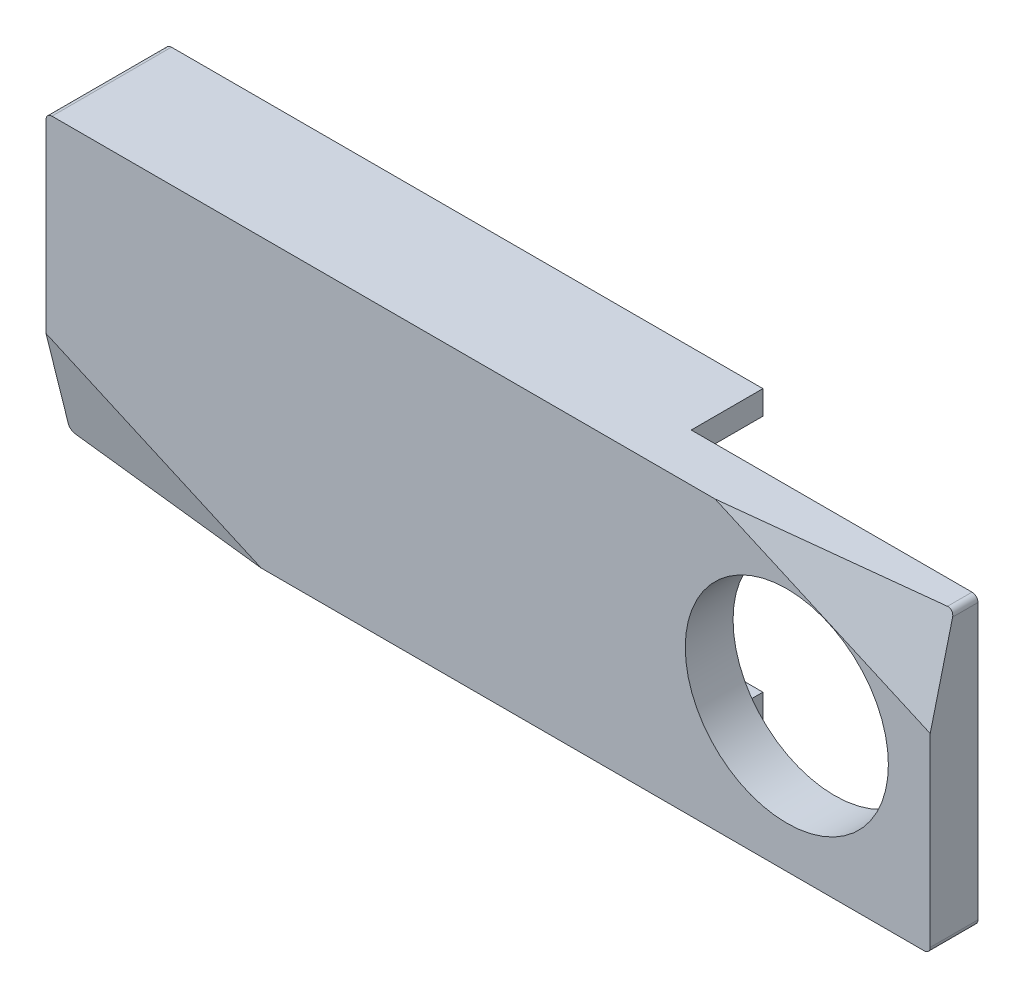
ISO-10303-21;
HEADER;
FILE_DESCRIPTION(('STEP AP214'),'2;1');
FILE_NAME('part.step','',(''),(''),'','','');
FILE_SCHEMA(('AUTOMOTIVE_DESIGN { 1 0 10303 214 1 1 1 1 }'));
ENDSEC;
DATA;
#1=APPLICATION_CONTEXT('core data for automotive mechanical design processes');
#2=APPLICATION_PROTOCOL_DEFINITION('international standard','automotive_design',2000,#1);
#3=PRODUCT_CONTEXT('',#1,'mechanical');
#4=PRODUCT('Part','Part','',(#3));
#5=PRODUCT_RELATED_PRODUCT_CATEGORY('part','',(#4));
#6=PRODUCT_DEFINITION_FORMATION('','',#4);
#7=PRODUCT_DEFINITION_CONTEXT('part definition',#1,'design');
#8=PRODUCT_DEFINITION('design','',#6,#7);
#9=PRODUCT_DEFINITION_SHAPE('','',#8);
#10=(LENGTH_UNIT() NAMED_UNIT(*) SI_UNIT(.MILLI.,.METRE.));
#11=(NAMED_UNIT(*) PLANE_ANGLE_UNIT() SI_UNIT($,.RADIAN.));
#12=(NAMED_UNIT(*) SI_UNIT($,.STERADIAN.) SOLID_ANGLE_UNIT());
#13=UNCERTAINTY_MEASURE_WITH_UNIT(LENGTH_MEASURE(1.E-05),#10,'distance_accuracy_value','');
#14=(GEOMETRIC_REPRESENTATION_CONTEXT(3) GLOBAL_UNCERTAINTY_ASSIGNED_CONTEXT((#13)) GLOBAL_UNIT_ASSIGNED_CONTEXT((#10,
#11,#12)) REPRESENTATION_CONTEXT('',''));
#15=CARTESIAN_POINT('',(0.,0.,0.));
#16=DIRECTION('',(0.,0.,1.));
#17=DIRECTION('',(1.,0.,0.));
#18=AXIS2_PLACEMENT_3D('',#15,#16,#17);
#19=CARTESIAN_POINT('',(-24.,-24.,6.));
#20=DIRECTION('',(-1.,0.,0.));
#21=DIRECTION('',(0.,0.,1.));
#22=AXIS2_PLACEMENT_3D('',#19,#20,#21);
#23=PLANE('',#22);
#24=DIRECTION('',(0.,0.,1.));
#25=VECTOR('',#24,1.);
#26=CARTESIAN_POINT('',(-24.,-22.,0.));
#27=LINE('',#26,#25);
#28=CARTESIAN_POINT('',(-24.,-22.,0.));
#29=VERTEX_POINT('',#28);
#30=CARTESIAN_POINT('',(-24.,-22.,6.));
#31=VERTEX_POINT('',#30);
#32=EDGE_CURVE('E204',#29,#31,#27,.T.);
#33=ORIENTED_EDGE('',*,*,#32,.T.);
#34=DIRECTION('',(0.,1.,0.));
#35=VECTOR('',#34,1.);
#36=CARTESIAN_POINT('',(-24.,-24.,6.));
#37=LINE('',#36,#35);
#38=CARTESIAN_POINT('',(-24.,-24.,6.));
#39=VERTEX_POINT('',#38);
#40=EDGE_CURVE('E223',#39,#31,#37,.T.);
#41=ORIENTED_EDGE('',*,*,#40,.F.);
#42=DIRECTION('',(0.,0.,-1.));
#43=VECTOR('',#42,1.);
#44=CARTESIAN_POINT('',(-24.,-24.,6.));
#45=LINE('',#44,#43);
#46=CARTESIAN_POINT('',(-24.,-24.,0.));
#47=VERTEX_POINT('',#46);
#48=EDGE_CURVE('E229',#39,#47,#45,.T.);
#49=ORIENTED_EDGE('',*,*,#48,.T.);
#50=DIRECTION('',(0.,1.,0.));
#51=VECTOR('',#50,1.);
#52=CARTESIAN_POINT('',(-24.,-24.,0.));
#53=LINE('',#52,#51);
#54=EDGE_CURVE('E220',#47,#29,#53,.T.);
#55=ORIENTED_EDGE('',*,*,#54,.T.);
#56=EDGE_LOOP('',(#33,#41,#49,#55));
#57=FACE_BOUND('',#56,.T.);
#58=ADVANCED_FACE('F35',(#57),#23,.F.);
#59=CARTESIAN_POINT('',(0.,0.,10.));
#60=DIRECTION('',(0.,0.,-1.));
#61=DIRECTION('',(-1.,0.,0.));
#62=AXIS2_PLACEMENT_3D('',#59,#60,#61);
#63=PLANE('',#62);
#64=DIRECTION('',(1.,0.,0.));
#65=VECTOR('',#64,1.);
#66=CARTESIAN_POINT('',(0.,-24.,10.));
#67=LINE('',#66,#65);
#68=CARTESIAN_POINT('',(-56.,-24.,10.));
#69=VERTEX_POINT('',#68);
#70=CARTESIAN_POINT('',(-0.499999999999997,-24.,10.));
#71=VERTEX_POINT('',#70);
#72=EDGE_CURVE('E250',#69,#71,#67,.T.);
#73=ORIENTED_EDGE('',*,*,#72,.T.);
#74=CARTESIAN_POINT('',(-0.499999999999997,-23.5,10.));
#75=DIRECTION('',(0.,0.,-1.));
#76=DIRECTION('',(-1.,0.,0.));
#77=AXIS2_PLACEMENT_3D('',#74,#75,#76);
#78=CIRCLE('',#77,0.5);
#79=CARTESIAN_POINT('',(0.,-23.5,10.));
#80=VERTEX_POINT('',#79);
#81=EDGE_CURVE('E300',#71,#80,#78,.F.);
#82=ORIENTED_EDGE('',*,*,#81,.T.);
#83=DIRECTION('',(0.,1.,0.));
#84=VECTOR('',#83,1.);
#85=CARTESIAN_POINT('',(0.,0.,10.));
#86=LINE('',#85,#84);
#87=CARTESIAN_POINT('',(0.,-7.99999999999999,10.));
#88=VERTEX_POINT('',#87);
#89=EDGE_CURVE('E242',#80,#88,#86,.T.);
#90=ORIENTED_EDGE('',*,*,#89,.T.);
#91=DIRECTION('',(-0.913811548620257,0.406138466053448,0.));
#92=VECTOR('',#91,1.);
#93=CARTESIAN_POINT('',(-2.96907216494845,-6.68041237113401,10.));
#94=LINE('',#93,#92);
#95=CARTESIAN_POINT('',(-18.,0.,10.));
#96=VERTEX_POINT('',#95);
#97=EDGE_CURVE('E264',#88,#96,#94,.T.);
#98=ORIENTED_EDGE('',*,*,#97,.T.);
#99=DIRECTION('',(-1.,0.,0.));
#100=VECTOR('',#99,1.);
#101=CARTESIAN_POINT('',(0.,0.,10.));
#102=LINE('',#101,#100);
#103=CARTESIAN_POINT('',(-73.5,0.,10.));
#104=VERTEX_POINT('',#103);
#105=EDGE_CURVE('E244',#96,#104,#102,.T.);
#106=ORIENTED_EDGE('',*,*,#105,.T.);
#107=CARTESIAN_POINT('',(-73.5,-0.500000000000009,10.));
#108=DIRECTION('',(0.,0.,-1.));
#109=DIRECTION('',(-1.,0.,0.));
#110=AXIS2_PLACEMENT_3D('',#107,#108,#109);
#111=CIRCLE('',#110,0.5);
#112=CARTESIAN_POINT('',(-74.,-0.500000000000009,10.));
#113=VERTEX_POINT('',#112);
#114=EDGE_CURVE('E298',#104,#113,#111,.F.);
#115=ORIENTED_EDGE('',*,*,#114,.T.);
#116=DIRECTION('',(0.,-1.,0.));
#117=VECTOR('',#116,1.);
#118=CARTESIAN_POINT('',(-74.,0.,10.));
#119=LINE('',#118,#117);
#120=CARTESIAN_POINT('',(-74.,-16.,10.));
#121=VERTEX_POINT('',#120);
#122=EDGE_CURVE('E248',#113,#121,#119,.T.);
#123=ORIENTED_EDGE('',*,*,#122,.T.);
#124=DIRECTION('',(-0.913811548620257,0.406138466053447,0.));
#125=VECTOR('',#124,1.);
#126=CARTESIAN_POINT('',(-18.1443298969072,-40.8247422680412,10.));
#127=LINE('',#126,#125);
#128=EDGE_CURVE('E267',#69,#121,#127,.T.);
#129=ORIENTED_EDGE('',*,*,#128,.F.);
#130=EDGE_LOOP('',(#73,#82,#90,#98,#106,#115,#123,#129));
#131=FACE_BOUND('',#130,.T.);
#132=CARTESIAN_POINT('',(-12.,-12.,10.));
#133=DIRECTION('',(0.,0.,-1.));
#134=DIRECTION('',(-1.,0.,0.));
#135=AXIS2_PLACEMENT_3D('',#132,#133,#134);
#136=CIRCLE('',#135,8.5);
#137=CARTESIAN_POINT('',(-20.5,-12.,10.));
#138=VERTEX_POINT('',#137);
#139=EDGE_CURVE('E238',#138,#138,#136,.T.);
#140=ORIENTED_EDGE('',*,*,#139,.T.);
#141=EDGE_LOOP('',(#140));
#142=FACE_BOUND('',#141,.T.);
#143=ADVANCED_FACE('F325',(#131,#142),#63,.F.);
#144=CARTESIAN_POINT('',(0.,0.,10.));
#145=DIRECTION('',(0.,-1.,0.));
#146=DIRECTION('',(1.,0.,0.));
#147=AXIS2_PLACEMENT_3D('',#144,#145,#146);
#148=PLANE('',#147);
#149=DIRECTION('',(0.993883734673619,0.,-0.110431526074847));
#150=VECTOR('',#149,1.);
#151=CARTESIAN_POINT('',(-0.219512195121951,0.,8.02439024390244));
#152=LINE('',#151,#150);
#153=CARTESIAN_POINT('',(-0.5,0.,8.05555555555556));
#154=VERTEX_POINT('',#153);
#155=EDGE_CURVE('E261',#96,#154,#152,.T.);
#156=ORIENTED_EDGE('',*,*,#155,.T.);
#157=DIRECTION('',(0.,0.,-1.));
#158=VECTOR('',#157,1.);
#159=CARTESIAN_POINT('',(-0.5,0.,10.));
#160=LINE('',#159,#158);
#161=CARTESIAN_POINT('',(-0.5,0.,6.));
#162=VERTEX_POINT('',#161);
#163=EDGE_CURVE('E279',#154,#162,#160,.T.);
#164=ORIENTED_EDGE('',*,*,#163,.T.);
#165=DIRECTION('',(1.,0.,0.));
#166=VECTOR('',#165,1.);
#167=CARTESIAN_POINT('',(0.,0.,6.));
#168=LINE('',#167,#166);
#169=CARTESIAN_POINT('',(-24.,0.,6.));
#170=VERTEX_POINT('',#169);
#171=EDGE_CURVE('E226',#170,#162,#168,.T.);
#172=ORIENTED_EDGE('',*,*,#171,.F.);
#173=DIRECTION('',(0.,0.,-1.));
#174=VECTOR('',#173,1.);
#175=CARTESIAN_POINT('',(-24.,0.,6.));
#176=LINE('',#175,#174);
#177=CARTESIAN_POINT('',(-24.,0.,0.));
#178=VERTEX_POINT('',#177);
#179=EDGE_CURVE('E232',#170,#178,#176,.T.);
#180=ORIENTED_EDGE('',*,*,#179,.T.);
#181=DIRECTION('',(-1.,0.,0.));
#182=VECTOR('',#181,1.);
#183=CARTESIAN_POINT('',(0.,0.,0.));
#184=LINE('',#183,#182);
#185=CARTESIAN_POINT('',(-73.5,0.,0.));
#186=VERTEX_POINT('',#185);
#187=EDGE_CURVE('E241',#178,#186,#184,.T.);
#188=ORIENTED_EDGE('',*,*,#187,.T.);
#189=DIRECTION('',(0.,0.,-1.));
#190=VECTOR('',#189,1.);
#191=CARTESIAN_POINT('',(-73.5,0.,10.));
#192=LINE('',#191,#190);
#193=EDGE_CURVE('E277',#186,#104,#192,.F.);
#194=ORIENTED_EDGE('',*,*,#193,.T.);
#195=ORIENTED_EDGE('',*,*,#105,.F.);
#196=EDGE_LOOP('',(#156,#164,#172,#180,#188,#194,#195));
#197=FACE_BOUND('',#196,.T.);
#198=ADVANCED_FACE('F317',(#197),#148,.F.);
#199=CARTESIAN_POINT('',(0.,0.,10.));
#200=DIRECTION('',(-1.,0.,0.));
#201=DIRECTION('',(0.,-1.,0.));
#202=AXIS2_PLACEMENT_3D('',#199,#200,#201);
#203=PLANE('',#202);
#204=DIRECTION('',(0.,-1.,0.));
#205=VECTOR('',#204,1.);
#206=CARTESIAN_POINT('',(0.,-24.,6.));
#207=LINE('',#206,#205);
#208=CARTESIAN_POINT('',(0.,-0.5,6.));
#209=VERTEX_POINT('',#208);
#210=CARTESIAN_POINT('',(0.,-23.5,6.));
#211=VERTEX_POINT('',#210);
#212=EDGE_CURVE('E216',#209,#211,#207,.T.);
#213=ORIENTED_EDGE('',*,*,#212,.F.);
#214=DIRECTION('',(0.,0.,-1.));
#215=VECTOR('',#214,1.);
#216=CARTESIAN_POINT('',(0.,-0.5,10.));
#217=LINE('',#216,#215);
#218=CARTESIAN_POINT('',(0.,-0.5,8.125));
#219=VERTEX_POINT('',#218);
#220=EDGE_CURVE('E289',#209,#219,#217,.F.);
#221=ORIENTED_EDGE('',*,*,#220,.T.);
#222=DIRECTION('',(0.,-0.970142500145332,0.242535625036333));
#223=VECTOR('',#222,1.);
#224=CARTESIAN_POINT('',(0.,-0.470588235294118,8.11764705882353));
#225=LINE('',#224,#223);
#226=EDGE_CURVE('E253',#219,#88,#225,.T.);
#227=ORIENTED_EDGE('',*,*,#226,.T.);
#228=ORIENTED_EDGE('',*,*,#89,.F.);
#229=DIRECTION('',(0.,0.,-1.));
#230=VECTOR('',#229,1.);
#231=CARTESIAN_POINT('',(0.,-23.5,10.));
#232=LINE('',#231,#230);
#233=EDGE_CURVE('E286',#80,#211,#232,.T.);
#234=ORIENTED_EDGE('',*,*,#233,.T.);
#235=EDGE_LOOP('',(#213,#221,#227,#228,#234));
#236=FACE_BOUND('',#235,.T.);
#237=ADVANCED_FACE('F344',(#236),#203,.F.);
#238=CARTESIAN_POINT('',(-74.,0.,10.));
#239=DIRECTION('',(1.,0.,0.));
#240=DIRECTION('',(0.,0.,-1.));
#241=AXIS2_PLACEMENT_3D('',#238,#239,#240);
#242=PLANE('',#241);
#243=DIRECTION('',(0.,1.,0.));
#244=VECTOR('',#243,1.);
#245=CARTESIAN_POINT('',(-74.,-20.,7.));
#246=LINE('',#245,#244);
#247=CARTESIAN_POINT('',(-74.,-20.,7.));
#248=VERTEX_POINT('',#247);
#249=CARTESIAN_POINT('',(-74.,-4.,7.));
#250=VERTEX_POINT('',#249);
#251=EDGE_CURVE('E172',#248,#250,#246,.T.);
#252=ORIENTED_EDGE('',*,*,#251,.F.);
#253=DIRECTION('',(0.,0.,-1.));
#254=VECTOR('',#253,1.);
#255=CARTESIAN_POINT('',(-74.,-20.,7.));
#256=LINE('',#255,#254);
#257=CARTESIAN_POINT('',(-74.,-20.,0.));
#258=VERTEX_POINT('',#257);
#259=EDGE_CURVE('E207',#248,#258,#256,.T.);
#260=ORIENTED_EDGE('',*,*,#259,.T.);
#261=DIRECTION('',(0.,-1.,0.));
#262=VECTOR('',#261,1.);
#263=CARTESIAN_POINT('',(-74.,0.,0.));
#264=LINE('',#263,#262);
#265=CARTESIAN_POINT('',(-74.,-23.5,0.));
#266=VERTEX_POINT('',#265);
#267=EDGE_CURVE('E256',#258,#266,#264,.T.);
#268=ORIENTED_EDGE('',*,*,#267,.T.);
#269=DIRECTION('',(0.,0.,-1.));
#270=VECTOR('',#269,1.);
#271=CARTESIAN_POINT('',(-74.,-23.5,10.));
#272=LINE('',#271,#270);
#273=CARTESIAN_POINT('',(-74.,-23.5,8.12500000000001));
#274=VERTEX_POINT('',#273);
#275=EDGE_CURVE('E302',#266,#274,#272,.F.);
#276=ORIENTED_EDGE('',*,*,#275,.T.);
#277=DIRECTION('',(0.,-0.970142500145332,-0.242535625036333));
#278=VECTOR('',#277,1.);
#279=CARTESIAN_POINT('',(-74.,-0.941176470588247,13.7647058823529));
#280=LINE('',#279,#278);
#281=EDGE_CURVE('E272',#121,#274,#280,.T.);
#282=ORIENTED_EDGE('',*,*,#281,.F.);
#283=ORIENTED_EDGE('',*,*,#122,.F.);
#284=DIRECTION('',(0.,0.,-1.));
#285=VECTOR('',#284,1.);
#286=CARTESIAN_POINT('',(-74.,-0.500000000000009,10.));
#287=LINE('',#286,#285);
#288=CARTESIAN_POINT('',(-74.,-0.500000000000009,0.));
#289=VERTEX_POINT('',#288);
#290=EDGE_CURVE('E304',#113,#289,#287,.T.);
#291=ORIENTED_EDGE('',*,*,#290,.T.);
#292=CARTESIAN_POINT('',(-74.,-4.,0.));
#293=VERTEX_POINT('',#292);
#294=EDGE_CURVE('E187',#289,#293,#264,.T.);
#295=ORIENTED_EDGE('',*,*,#294,.T.);
#296=DIRECTION('',(0.,0.,-1.));
#297=VECTOR('',#296,1.);
#298=CARTESIAN_POINT('',(-74.,-4.,7.));
#299=LINE('',#298,#297);
#300=EDGE_CURVE('E50',#250,#293,#299,.T.);
#301=ORIENTED_EDGE('',*,*,#300,.F.);
#302=EDGE_LOOP('',(#252,#260,#268,#276,#282,#283,#291,#295,#301));
#303=FACE_BOUND('',#302,.T.);
#304=ADVANCED_FACE('F184',(#303),#242,.F.);
#305=CARTESIAN_POINT('',(0.,-24.,10.));
#306=DIRECTION('',(0.,1.,0.));
#307=DIRECTION('',(-1.,0.,0.));
#308=AXIS2_PLACEMENT_3D('',#305,#306,#307);
#309=PLANE('',#308);
#310=DIRECTION('',(-1.,0.,0.));
#311=VECTOR('',#310,1.);
#312=CARTESIAN_POINT('',(0.,-24.,6.));
#313=LINE('',#312,#311);
#314=CARTESIAN_POINT('',(-0.499999999999997,-24.,6.));
#315=VERTEX_POINT('',#314);
#316=EDGE_CURVE('E219',#315,#39,#313,.T.);
#317=ORIENTED_EDGE('',*,*,#316,.F.);
#318=DIRECTION('',(0.,0.,-1.));
#319=VECTOR('',#318,1.);
#320=CARTESIAN_POINT('',(-0.499999999999997,-24.,10.));
#321=LINE('',#320,#319);
#322=EDGE_CURVE('E296',#315,#71,#321,.F.);
#323=ORIENTED_EDGE('',*,*,#322,.T.);
#324=ORIENTED_EDGE('',*,*,#72,.F.);
#325=DIRECTION('',(0.993883734673619,0.,0.110431526074847));
#326=VECTOR('',#325,1.);
#327=CARTESIAN_POINT('',(-0.68292682926829,-24.,16.1463414634146));
#328=LINE('',#327,#326);
#329=CARTESIAN_POINT('',(-73.5,-24.,8.05555555555556));
#330=VERTEX_POINT('',#329);
#331=EDGE_CURVE('E275',#330,#69,#328,.T.);
#332=ORIENTED_EDGE('',*,*,#331,.F.);
#333=DIRECTION('',(0.,0.,-1.));
#334=VECTOR('',#333,1.);
#335=CARTESIAN_POINT('',(-73.5,-24.,10.));
#336=LINE('',#335,#334);
#337=CARTESIAN_POINT('',(-73.5,-24.,0.));
#338=VERTEX_POINT('',#337);
#339=EDGE_CURVE('E293',#330,#338,#336,.T.);
#340=ORIENTED_EDGE('',*,*,#339,.T.);
#341=DIRECTION('',(1.,0.,0.));
#342=VECTOR('',#341,1.);
#343=CARTESIAN_POINT('',(0.,-24.,0.));
#344=LINE('',#343,#342);
#345=EDGE_CURVE('E245',#338,#47,#344,.T.);
#346=ORIENTED_EDGE('',*,*,#345,.T.);
#347=ORIENTED_EDGE('',*,*,#48,.F.);
#348=EDGE_LOOP('',(#317,#323,#324,#332,#340,#346,#347));
#349=FACE_BOUND('',#348,.T.);
#350=ADVANCED_FACE('F367',(#349),#309,.F.);
#351=CARTESIAN_POINT('',(0.,0.,0.));
#352=DIRECTION('',(0.,0.,-1.));
#353=DIRECTION('',(-1.,0.,0.));
#354=AXIS2_PLACEMENT_3D('',#351,#352,#353);
#355=PLANE('',#354);
#356=DIRECTION('',(-1.,0.,0.));
#357=VECTOR('',#356,1.);
#358=CARTESIAN_POINT('',(-74.,-20.,0.));
#359=LINE('',#358,#357);
#360=CARTESIAN_POINT('',(-41.,-20.,0.));
#361=VERTEX_POINT('',#360);
#362=EDGE_CURVE('E181',#361,#258,#359,.T.);
#363=ORIENTED_EDGE('',*,*,#362,.F.);
#364=DIRECTION('',(0.,-1.,0.));
#365=VECTOR('',#364,1.);
#366=CARTESIAN_POINT('',(-41.,-20.,0.));
#367=LINE('',#366,#365);
#368=CARTESIAN_POINT('',(-41.,-4.,0.));
#369=VERTEX_POINT('',#368);
#370=EDGE_CURVE('E563',#369,#361,#367,.T.);
#371=ORIENTED_EDGE('',*,*,#370,.F.);
#372=DIRECTION('',(1.,0.,0.));
#373=VECTOR('',#372,1.);
#374=CARTESIAN_POINT('',(-74.,-4.,0.));
#375=LINE('',#374,#373);
#376=EDGE_CURVE('E566',#293,#369,#375,.T.);
#377=ORIENTED_EDGE('',*,*,#376,.F.);
#378=ORIENTED_EDGE('',*,*,#294,.F.);
#379=CARTESIAN_POINT('',(-73.5,-0.500000000000009,0.));
#380=DIRECTION('',(0.,0.,-1.));
#381=DIRECTION('',(-1.,0.,0.));
#382=AXIS2_PLACEMENT_3D('',#379,#380,#381);
#383=CIRCLE('',#382,0.5);
#384=EDGE_CURVE('E43',#289,#186,#383,.T.);
#385=ORIENTED_EDGE('',*,*,#384,.T.);
#386=ORIENTED_EDGE('',*,*,#187,.F.);
#387=CARTESIAN_POINT('',(-24.,-2.00000000000001,0.));
#388=VERTEX_POINT('',#387);
#389=EDGE_CURVE('E214',#388,#178,#53,.T.);
#390=ORIENTED_EDGE('',*,*,#389,.F.);
#391=DIRECTION('',(1.,0.,0.));
#392=VECTOR('',#391,1.);
#393=CARTESIAN_POINT('',(-39.,-2.00000000000001,0.));
#394=LINE('',#393,#392);
#395=CARTESIAN_POINT('',(-39.,-2.00000000000001,0.));
#396=VERTEX_POINT('',#395);
#397=EDGE_CURVE('E201',#396,#388,#394,.T.);
#398=ORIENTED_EDGE('',*,*,#397,.F.);
#399=DIRECTION('',(0.,-1.,0.));
#400=VECTOR('',#399,1.);
#401=CARTESIAN_POINT('',(-39.,-2.00000000000001,0.));
#402=LINE('',#401,#400);
#403=CARTESIAN_POINT('',(-39.,-22.,0.));
#404=VERTEX_POINT('',#403);
#405=EDGE_CURVE('E211',#396,#404,#402,.T.);
#406=ORIENTED_EDGE('',*,*,#405,.T.);
#407=DIRECTION('',(1.,0.,0.));
#408=VECTOR('',#407,1.);
#409=CARTESIAN_POINT('',(-39.,-22.,0.));
#410=LINE('',#409,#408);
#411=EDGE_CURVE('E198',#404,#29,#410,.T.);
#412=ORIENTED_EDGE('',*,*,#411,.T.);
#413=ORIENTED_EDGE('',*,*,#54,.F.);
#414=ORIENTED_EDGE('',*,*,#345,.F.);
#415=CARTESIAN_POINT('',(-73.5,-23.5,0.));
#416=DIRECTION('',(0.,0.,-1.));
#417=DIRECTION('',(-1.,0.,0.));
#418=AXIS2_PLACEMENT_3D('',#415,#416,#417);
#419=CIRCLE('',#418,0.5);
#420=EDGE_CURVE('E306',#338,#266,#419,.T.);
#421=ORIENTED_EDGE('',*,*,#420,.T.);
#422=ORIENTED_EDGE('',*,*,#267,.F.);
#423=EDGE_LOOP('',(#363,#371,#377,#378,#385,#386,#390,#398,#406,#412,#413,#414,#421,#422));
#424=FACE_BOUND('',#423,.T.);
#425=ADVANCED_FACE('F311',(#424),#355,.T.);
#426=CARTESIAN_POINT('',(0.826992103374013,1.86073223259153,7.44292893036612));
#427=DIRECTION('',(-0.107172764430849,-0.24113871996941,-0.964554879877638));
#428=DIRECTION('',(0.,0.970142500145332,-0.242535625036333));
#429=AXIS2_PLACEMENT_3D('',#426,#427,#428);
#430=PLANE('',#429);
#431=ORIENTED_EDGE('',*,*,#226,.F.);
#432=CARTESIAN_POINT('',(-0.5,-0.5,8.18055555555556));
#433=DIRECTION('',(-0.107172764430849,-0.24113871996941,-0.964554879877638));
#434=DIRECTION('',(0.391742839337871,0.88142138851021,-0.263882329276205));
#435=AXIS2_PLACEMENT_3D('',#432,#433,#434);
#436=ELLIPSE('',#435,0.518373822403376,0.5);
#437=EDGE_CURVE('E291',#219,#154,#436,.F.);
#438=ORIENTED_EDGE('',*,*,#437,.T.);
#439=ORIENTED_EDGE('',*,*,#155,.F.);
#440=ORIENTED_EDGE('',*,*,#97,.F.);
#441=EDGE_LOOP('',(#431,#438,#439,#440));
#442=FACE_BOUND('',#441,.T.);
#443=ADVANCED_FACE('F357',(#442),#430,.F.);
#444=CARTESIAN_POINT('',(-12.,-12.,10.));
#445=DIRECTION('',(0.,0.,-1.));
#446=DIRECTION('',(-1.,0.,0.));
#447=AXIS2_PLACEMENT_3D('',#444,#445,#446);
#448=CYLINDRICAL_SURFACE('',#447,8.5);
#449=CARTESIAN_POINT('',(-12.,-12.,6.));
#450=DIRECTION('',(0.,0.,1.));
#451=DIRECTION('',(1.,0.,0.));
#452=AXIS2_PLACEMENT_3D('',#449,#450,#451);
#453=CIRCLE('',#452,8.5);
#454=CARTESIAN_POINT('',(-3.5,-12.,6.));
#455=VERTEX_POINT('',#454);
#456=EDGE_CURVE('E235',#455,#455,#453,.F.);
#457=ORIENTED_EDGE('',*,*,#456,.T.);
#458=EDGE_LOOP('',(#457));
#459=FACE_BOUND('',#458,.T.);
#460=ORIENTED_EDGE('',*,*,#139,.F.);
#461=EDGE_LOOP('',(#460));
#462=FACE_BOUND('',#461,.T.);
#463=ADVANCED_FACE('F359',(#459,#462),#448,.F.);
#464=CARTESIAN_POINT('',(0.,0.,6.));
#465=DIRECTION('',(0.,0.,1.));
#466=DIRECTION('',(1.,0.,0.));
#467=AXIS2_PLACEMENT_3D('',#464,#465,#466);
#468=PLANE('',#467);
#469=ORIENTED_EDGE('',*,*,#171,.T.);
#470=CARTESIAN_POINT('',(-0.5,-0.5,6.));
#471=DIRECTION('',(0.,0.,1.));
#472=DIRECTION('',(1.,0.,0.));
#473=AXIS2_PLACEMENT_3D('',#470,#471,#472);
#474=CIRCLE('',#473,0.5);
#475=EDGE_CURVE('E284',#162,#209,#474,.F.);
#476=ORIENTED_EDGE('',*,*,#475,.T.);
#477=ORIENTED_EDGE('',*,*,#212,.T.);
#478=CARTESIAN_POINT('',(-0.499999999999997,-23.5,6.));
#479=DIRECTION('',(0.,0.,1.));
#480=DIRECTION('',(1.,0.,0.));
#481=AXIS2_PLACEMENT_3D('',#478,#479,#480);
#482=CIRCLE('',#481,0.5);
#483=EDGE_CURVE('E282',#211,#315,#482,.F.);
#484=ORIENTED_EDGE('',*,*,#483,.T.);
#485=ORIENTED_EDGE('',*,*,#316,.T.);
#486=ORIENTED_EDGE('',*,*,#40,.T.);
#487=DIRECTION('',(0.,-1.,0.));
#488=VECTOR('',#487,1.);
#489=CARTESIAN_POINT('',(-24.,-2.00000000000001,6.));
#490=LINE('',#489,#488);
#491=CARTESIAN_POINT('',(-24.,-2.00000000000001,6.));
#492=VERTEX_POINT('',#491);
#493=EDGE_CURVE('E203',#492,#31,#490,.T.);
#494=ORIENTED_EDGE('',*,*,#493,.F.);
#495=EDGE_CURVE('E222',#492,#170,#37,.T.);
#496=ORIENTED_EDGE('',*,*,#495,.T.);
#497=EDGE_LOOP('',(#469,#476,#477,#484,#485,#486,#494,#496));
#498=FACE_BOUND('',#497,.T.);
#499=ORIENTED_EDGE('',*,*,#456,.F.);
#500=EDGE_LOOP('',(#499));
#501=FACE_BOUND('',#500,.T.);
#502=ADVANCED_FACE('F347',(#498,#501),#468,.F.);
#503=ORIENTED_EDGE('',*,*,#495,.F.);
#504=DIRECTION('',(0.,0.,1.));
#505=VECTOR('',#504,1.);
#506=CARTESIAN_POINT('',(-24.,-2.00000000000001,0.));
#507=LINE('',#506,#505);
#508=EDGE_CURVE('E194',#388,#492,#507,.T.);
#509=ORIENTED_EDGE('',*,*,#508,.F.);
#510=ORIENTED_EDGE('',*,*,#389,.T.);
#511=ORIENTED_EDGE('',*,*,#179,.F.);
#512=EDGE_LOOP('',(#503,#509,#510,#511));
#513=FACE_BOUND('',#512,.T.);
#514=ADVANCED_FACE('F373',(#513),#23,.F.);
#515=CARTESIAN_POINT('',(-2.29720028715003,-5.16870064608758,20.6748025843503));
#516=DIRECTION('',(-0.107172764430849,-0.24113871996941,0.964554879877638));
#517=DIRECTION('',(0.,-0.970142500145332,-0.242535625036333));
#518=AXIS2_PLACEMENT_3D('',#515,#516,#517);
#519=PLANE('',#518);
#520=ORIENTED_EDGE('',*,*,#281,.T.);
#521=CARTESIAN_POINT('',(-73.5,-23.5,8.18055555555556));
#522=DIRECTION('',(-0.107172764430849,-0.24113871996941,0.964554879877638));
#523=DIRECTION('',(-0.391742839337871,-0.881421388510211,-0.263882329276205));
#524=AXIS2_PLACEMENT_3D('',#521,#522,#523);
#525=ELLIPSE('',#524,0.518373822403376,0.5);
#526=EDGE_CURVE('E11',#274,#330,#525,.T.);
#527=ORIENTED_EDGE('',*,*,#526,.T.);
#528=ORIENTED_EDGE('',*,*,#331,.T.);
#529=ORIENTED_EDGE('',*,*,#128,.T.);
#530=EDGE_LOOP('',(#520,#527,#528,#529));
#531=FACE_BOUND('',#530,.T.);
#532=ADVANCED_FACE('F332',(#531),#519,.T.);
#533=CARTESIAN_POINT('',(-0.5,-0.5,10.));
#534=DIRECTION('',(0.,0.,-1.));
#535=DIRECTION('',(-1.,0.,0.));
#536=AXIS2_PLACEMENT_3D('',#533,#534,#535);
#537=CYLINDRICAL_SURFACE('',#536,0.5);
#538=ORIENTED_EDGE('',*,*,#437,.F.);
#539=ORIENTED_EDGE('',*,*,#220,.F.);
#540=ORIENTED_EDGE('',*,*,#475,.F.);
#541=ORIENTED_EDGE('',*,*,#163,.F.);
#542=EDGE_LOOP('',(#538,#539,#540,#541));
#543=FACE_BOUND('',#542,.T.);
#544=ADVANCED_FACE('F353',(#543),#537,.T.);
#545=CARTESIAN_POINT('',(-0.499999999999997,-23.5,10.));
#546=DIRECTION('',(0.,0.,-1.));
#547=DIRECTION('',(-1.,0.,0.));
#548=AXIS2_PLACEMENT_3D('',#545,#546,#547);
#549=CYLINDRICAL_SURFACE('',#548,0.5);
#550=ORIENTED_EDGE('',*,*,#81,.F.);
#551=ORIENTED_EDGE('',*,*,#322,.F.);
#552=ORIENTED_EDGE('',*,*,#483,.F.);
#553=ORIENTED_EDGE('',*,*,#233,.F.);
#554=EDGE_LOOP('',(#550,#551,#552,#553));
#555=FACE_BOUND('',#554,.T.);
#556=ADVANCED_FACE('F341',(#555),#549,.T.);
#557=CARTESIAN_POINT('',(-73.5,-0.500000000000009,10.));
#558=DIRECTION('',(0.,0.,-1.));
#559=DIRECTION('',(-1.,0.,0.));
#560=AXIS2_PLACEMENT_3D('',#557,#558,#559);
#561=CYLINDRICAL_SURFACE('',#560,0.5);
#562=ORIENTED_EDGE('',*,*,#114,.F.);
#563=ORIENTED_EDGE('',*,*,#193,.F.);
#564=ORIENTED_EDGE('',*,*,#384,.F.);
#565=ORIENTED_EDGE('',*,*,#290,.F.);
#566=EDGE_LOOP('',(#562,#563,#564,#565));
#567=FACE_BOUND('',#566,.T.);
#568=ADVANCED_FACE('F322',(#567),#561,.T.);
#569=CARTESIAN_POINT('',(-73.5,-23.5,10.));
#570=DIRECTION('',(0.,0.,-1.));
#571=DIRECTION('',(-1.,0.,0.));
#572=AXIS2_PLACEMENT_3D('',#569,#570,#571);
#573=CYLINDRICAL_SURFACE('',#572,0.5);
#574=ORIENTED_EDGE('',*,*,#526,.F.);
#575=ORIENTED_EDGE('',*,*,#275,.F.);
#576=ORIENTED_EDGE('',*,*,#420,.F.);
#577=ORIENTED_EDGE('',*,*,#339,.F.);
#578=EDGE_LOOP('',(#574,#575,#576,#577));
#579=FACE_BOUND('',#578,.T.);
#580=ADVANCED_FACE('F37',(#579),#573,.T.);
#581=CARTESIAN_POINT('',(-24.,-2.00000000000001,6.));
#582=DIRECTION('',(-0.371390676354104,0.,0.928476690885259));
#583=DIRECTION('',(0.928476690885259,0.,0.371390676354104));
#584=AXIS2_PLACEMENT_3D('',#581,#582,#583);
#585=PLANE('',#584);
#586=DIRECTION('',(-0.92847669088526,0.,-0.371390676354104));
#587=VECTOR('',#586,1.);
#588=CARTESIAN_POINT('',(-24.,-22.,6.));
#589=LINE('',#588,#587);
#590=EDGE_CURVE('E58',#31,#404,#589,.T.);
#591=ORIENTED_EDGE('',*,*,#590,.T.);
#592=ORIENTED_EDGE('',*,*,#405,.F.);
#593=DIRECTION('',(-0.92847669088526,0.,-0.371390676354104));
#594=VECTOR('',#593,1.);
#595=CARTESIAN_POINT('',(-24.,-2.00000000000001,6.));
#596=LINE('',#595,#594);
#597=EDGE_CURVE('E197',#492,#396,#596,.T.);
#598=ORIENTED_EDGE('',*,*,#597,.F.);
#599=ORIENTED_EDGE('',*,*,#493,.T.);
#600=EDGE_LOOP('',(#591,#592,#598,#599));
#601=FACE_BOUND('',#600,.T.);
#602=ADVANCED_FACE('F390',(#601),#585,.F.);
#603=CARTESIAN_POINT('',(0.,-2.,0.));
#604=DIRECTION('',(0.,1.,0.));
#605=DIRECTION('',(-1.,0.,0.));
#606=AXIS2_PLACEMENT_3D('',#603,#604,#605);
#607=PLANE('',#606);
#608=ORIENTED_EDGE('',*,*,#508,.T.);
#609=ORIENTED_EDGE('',*,*,#597,.T.);
#610=ORIENTED_EDGE('',*,*,#397,.T.);
#611=EDGE_LOOP('',(#608,#609,#610));
#612=FACE_BOUND('',#611,.T.);
#613=ADVANCED_FACE('F397',(#612),#607,.F.);
#614=CARTESIAN_POINT('',(0.,-22.,0.));
#615=DIRECTION('',(0.,1.,0.));
#616=DIRECTION('',(-1.,0.,0.));
#617=AXIS2_PLACEMENT_3D('',#614,#615,#616);
#618=PLANE('',#617);
#619=ORIENTED_EDGE('',*,*,#32,.F.);
#620=ORIENTED_EDGE('',*,*,#411,.F.);
#621=ORIENTED_EDGE('',*,*,#590,.F.);
#622=EDGE_LOOP('',(#619,#620,#621));
#623=FACE_BOUND('',#622,.T.);
#624=ADVANCED_FACE('F393',(#623),#618,.T.);
#625=CARTESIAN_POINT('',(-74.,-20.,7.));
#626=DIRECTION('',(0.,-1.,0.));
#627=DIRECTION('',(1.,0.,0.));
#628=AXIS2_PLACEMENT_3D('',#625,#626,#627);
#629=PLANE('',#628);
#630=ORIENTED_EDGE('',*,*,#362,.T.);
#631=ORIENTED_EDGE('',*,*,#259,.F.);
#632=DIRECTION('',(-1.,0.,0.));
#633=VECTOR('',#632,1.);
#634=CARTESIAN_POINT('',(-74.,-20.,7.));
#635=LINE('',#634,#633);
#636=CARTESIAN_POINT('',(-41.,-20.,7.));
#637=VERTEX_POINT('',#636);
#638=EDGE_CURVE('E178',#637,#248,#635,.T.);
#639=ORIENTED_EDGE('',*,*,#638,.F.);
#640=DIRECTION('',(0.,0.,-1.));
#641=VECTOR('',#640,1.);
#642=CARTESIAN_POINT('',(-41.,-20.,7.));
#643=LINE('',#642,#641);
#644=EDGE_CURVE('E189',#637,#361,#643,.T.);
#645=ORIENTED_EDGE('',*,*,#644,.T.);
#646=EDGE_LOOP('',(#630,#631,#639,#645));
#647=FACE_BOUND('',#646,.T.);
#648=ADVANCED_FACE('F404',(#647),#629,.F.);
#649=CARTESIAN_POINT('',(-41.,-20.,7.));
#650=DIRECTION('',(1.,0.,0.));
#651=DIRECTION('',(0.,0.,-1.));
#652=AXIS2_PLACEMENT_3D('',#649,#650,#651);
#653=PLANE('',#652);
#654=ORIENTED_EDGE('',*,*,#370,.T.);
#655=ORIENTED_EDGE('',*,*,#644,.F.);
#656=DIRECTION('',(0.,-1.,0.));
#657=VECTOR('',#656,1.);
#658=CARTESIAN_POINT('',(-41.,-20.,7.));
#659=LINE('',#658,#657);
#660=CARTESIAN_POINT('',(-41.,-4.,7.));
#661=VERTEX_POINT('',#660);
#662=EDGE_CURVE('E171',#661,#637,#659,.T.);
#663=ORIENTED_EDGE('',*,*,#662,.F.);
#664=DIRECTION('',(0.,0.,-1.));
#665=VECTOR('',#664,1.);
#666=CARTESIAN_POINT('',(-41.,-4.,7.));
#667=LINE('',#666,#665);
#668=EDGE_CURVE('E167',#661,#369,#667,.T.);
#669=ORIENTED_EDGE('',*,*,#668,.T.);
#670=EDGE_LOOP('',(#654,#655,#663,#669));
#671=FACE_BOUND('',#670,.T.);
#672=ADVANCED_FACE('F410',(#671),#653,.F.);
#673=CARTESIAN_POINT('',(-74.,-4.,7.));
#674=DIRECTION('',(0.,1.,0.));
#675=DIRECTION('',(-1.,0.,0.));
#676=AXIS2_PLACEMENT_3D('',#673,#674,#675);
#677=PLANE('',#676);
#678=ORIENTED_EDGE('',*,*,#376,.T.);
#679=ORIENTED_EDGE('',*,*,#668,.F.);
#680=DIRECTION('',(1.,0.,0.));
#681=VECTOR('',#680,1.);
#682=CARTESIAN_POINT('',(-74.,-4.,7.));
#683=LINE('',#682,#681);
#684=EDGE_CURVE('E164',#250,#661,#683,.T.);
#685=ORIENTED_EDGE('',*,*,#684,.F.);
#686=ORIENTED_EDGE('',*,*,#300,.T.);
#687=EDGE_LOOP('',(#678,#679,#685,#686));
#688=FACE_BOUND('',#687,.T.);
#689=ADVANCED_FACE('F166',(#688),#677,.F.);
#690=CARTESIAN_POINT('',(0.,0.,7.));
#691=DIRECTION('',(0.,0.,-1.));
#692=DIRECTION('',(-1.,0.,0.));
#693=AXIS2_PLACEMENT_3D('',#690,#691,#692);
#694=PLANE('',#693);
#695=ORIENTED_EDGE('',*,*,#251,.T.);
#696=ORIENTED_EDGE('',*,*,#684,.T.);
#697=ORIENTED_EDGE('',*,*,#662,.T.);
#698=ORIENTED_EDGE('',*,*,#638,.T.);
#699=EDGE_LOOP('',(#695,#696,#697,#698));
#700=FACE_BOUND('',#699,.T.);
#701=ADVANCED_FACE('F176',(#700),#694,.T.);
#702=CLOSED_SHELL('',(#58,#143,#198,#237,#304,#350,#425,#443,#463,#502,#514,#532,#544,#556,#568,
#580,#602,#613,#624,#648,#672,#689,#701));
#703=MANIFOLD_SOLID_BREP('B2',#702);
#704=ADVANCED_BREP_SHAPE_REPRESENTATION('',(#18,#703),#14);
#705=SHAPE_DEFINITION_REPRESENTATION(#9,#704);
ENDSEC;
END-ISO-10303-21;
